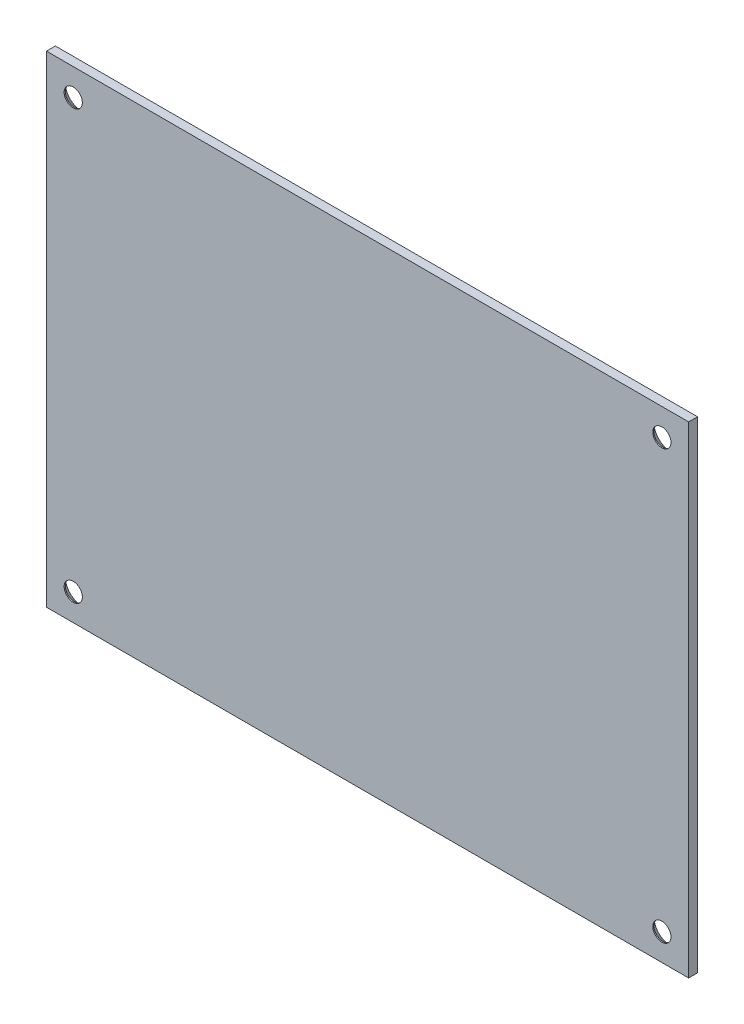
ISO-10303-21;
HEADER;
FILE_DESCRIPTION(('STEP AP214'),'2;1');
FILE_NAME('part.step','',(''),(''),'','','');
FILE_SCHEMA(('AUTOMOTIVE_DESIGN { 1 0 10303 214 1 1 1 1 }'));
ENDSEC;
DATA;
#1=APPLICATION_CONTEXT('core data for automotive mechanical design processes');
#2=APPLICATION_PROTOCOL_DEFINITION('international standard','automotive_design',2000,#1);
#3=PRODUCT_CONTEXT('',#1,'mechanical');
#4=PRODUCT('Part','Part','',(#3));
#5=PRODUCT_RELATED_PRODUCT_CATEGORY('part','',(#4));
#6=PRODUCT_DEFINITION_FORMATION('','',#4);
#7=PRODUCT_DEFINITION_CONTEXT('part definition',#1,'design');
#8=PRODUCT_DEFINITION('design','',#6,#7);
#9=PRODUCT_DEFINITION_SHAPE('','',#8);
#10=(LENGTH_UNIT() NAMED_UNIT(*) SI_UNIT(.MILLI.,.METRE.));
#11=(NAMED_UNIT(*) PLANE_ANGLE_UNIT() SI_UNIT($,.RADIAN.));
#12=(NAMED_UNIT(*) SI_UNIT($,.STERADIAN.) SOLID_ANGLE_UNIT());
#13=UNCERTAINTY_MEASURE_WITH_UNIT(LENGTH_MEASURE(1.E-05),#10,'distance_accuracy_value','');
#14=(GEOMETRIC_REPRESENTATION_CONTEXT(3) GLOBAL_UNCERTAINTY_ASSIGNED_CONTEXT((#13)) GLOBAL_UNIT_ASSIGNED_CONTEXT((#10,
#11,#12)) REPRESENTATION_CONTEXT('',''));
#15=CARTESIAN_POINT('',(0.,0.,0.));
#16=DIRECTION('',(0.,0.,1.));
#17=DIRECTION('',(1.,0.,0.));
#18=AXIS2_PLACEMENT_3D('',#15,#16,#17);
#19=CARTESIAN_POINT('',(0.,0.,1.66));
#20=DIRECTION('',(1.,0.,0.));
#21=DIRECTION('',(0.,0.,-1.));
#22=AXIS2_PLACEMENT_3D('',#19,#20,#21);
#23=PLANE('',#22);
#24=DIRECTION('',(0.,-1.,0.));
#25=VECTOR('',#24,1.);
#26=CARTESIAN_POINT('',(0.,0.,0.));
#27=LINE('',#26,#25);
#28=CARTESIAN_POINT('',(0.,90.,0.));
#29=VERTEX_POINT('',#28);
#30=CARTESIAN_POINT('',(0.,0.,0.));
#31=VERTEX_POINT('',#30);
#32=EDGE_CURVE('E116',#29,#31,#27,.T.);
#33=ORIENTED_EDGE('',*,*,#32,.T.);
#34=DIRECTION('',(0.,0.,-1.));
#35=VECTOR('',#34,1.);
#36=CARTESIAN_POINT('',(0.,0.,1.66));
#37=LINE('',#36,#35);
#38=CARTESIAN_POINT('',(0.,0.,1.66));
#39=VERTEX_POINT('',#38);
#40=EDGE_CURVE('E11',#39,#31,#37,.T.);
#41=ORIENTED_EDGE('',*,*,#40,.F.);
#42=DIRECTION('',(0.,-1.,0.));
#43=VECTOR('',#42,1.);
#44=CARTESIAN_POINT('',(0.,0.,1.66));
#45=LINE('',#44,#43);
#46=CARTESIAN_POINT('',(0.,90.,1.66));
#47=VERTEX_POINT('',#46);
#48=EDGE_CURVE('E99',#47,#39,#45,.T.);
#49=ORIENTED_EDGE('',*,*,#48,.F.);
#50=DIRECTION('',(0.,0.,-1.));
#51=VECTOR('',#50,1.);
#52=CARTESIAN_POINT('',(0.,90.,1.66));
#53=LINE('',#52,#51);
#54=EDGE_CURVE('E112',#47,#29,#53,.T.);
#55=ORIENTED_EDGE('',*,*,#54,.T.);
#56=EDGE_LOOP('',(#33,#41,#49,#55));
#57=FACE_BOUND('',#56,.T.);
#58=ADVANCED_FACE('F45',(#57),#23,.F.);
#59=CARTESIAN_POINT('',(0.,0.,1.66));
#60=DIRECTION('',(0.,1.,0.));
#61=DIRECTION('',(0.,0.,1.));
#62=AXIS2_PLACEMENT_3D('',#59,#60,#61);
#63=PLANE('',#62);
#64=DIRECTION('',(1.,0.,0.));
#65=VECTOR('',#64,1.);
#66=CARTESIAN_POINT('',(0.,0.,0.));
#67=LINE('',#66,#65);
#68=CARTESIAN_POINT('',(120.,0.,0.));
#69=VERTEX_POINT('',#68);
#70=EDGE_CURVE('E104',#31,#69,#67,.T.);
#71=ORIENTED_EDGE('',*,*,#70,.T.);
#72=DIRECTION('',(0.,0.,-1.));
#73=VECTOR('',#72,1.);
#74=CARTESIAN_POINT('',(120.,0.,1.66));
#75=LINE('',#74,#73);
#76=CARTESIAN_POINT('',(120.,0.,1.66));
#77=VERTEX_POINT('',#76);
#78=EDGE_CURVE('E55',#77,#69,#75,.T.);
#79=ORIENTED_EDGE('',*,*,#78,.F.);
#80=DIRECTION('',(1.,0.,0.));
#81=VECTOR('',#80,1.);
#82=CARTESIAN_POINT('',(0.,0.,1.66));
#83=LINE('',#82,#81);
#84=EDGE_CURVE('E94',#39,#77,#83,.T.);
#85=ORIENTED_EDGE('',*,*,#84,.F.);
#86=ORIENTED_EDGE('',*,*,#40,.T.);
#87=EDGE_LOOP('',(#71,#79,#85,#86));
#88=FACE_BOUND('',#87,.T.);
#89=ADVANCED_FACE('F103',(#88),#63,.F.);
#90=CARTESIAN_POINT('',(120.,0.,1.66));
#91=DIRECTION('',(-1.,0.,0.));
#92=DIRECTION('',(0.,0.,1.));
#93=AXIS2_PLACEMENT_3D('',#90,#91,#92);
#94=PLANE('',#93);
#95=DIRECTION('',(0.,1.,0.));
#96=VECTOR('',#95,1.);
#97=CARTESIAN_POINT('',(120.,0.,0.));
#98=LINE('',#97,#96);
#99=CARTESIAN_POINT('',(120.,90.,0.));
#100=VERTEX_POINT('',#99);
#101=EDGE_CURVE('E81',#69,#100,#98,.T.);
#102=ORIENTED_EDGE('',*,*,#101,.T.);
#103=DIRECTION('',(0.,0.,-1.));
#104=VECTOR('',#103,1.);
#105=CARTESIAN_POINT('',(120.,90.,1.66));
#106=LINE('',#105,#104);
#107=CARTESIAN_POINT('',(120.,90.,1.66));
#108=VERTEX_POINT('',#107);
#109=EDGE_CURVE('E106',#108,#100,#106,.T.);
#110=ORIENTED_EDGE('',*,*,#109,.F.);
#111=DIRECTION('',(0.,1.,0.));
#112=VECTOR('',#111,1.);
#113=CARTESIAN_POINT('',(120.,0.,1.66));
#114=LINE('',#113,#112);
#115=EDGE_CURVE('E97',#77,#108,#114,.T.);
#116=ORIENTED_EDGE('',*,*,#115,.F.);
#117=ORIENTED_EDGE('',*,*,#78,.T.);
#118=EDGE_LOOP('',(#102,#110,#116,#117));
#119=FACE_BOUND('',#118,.T.);
#120=ADVANCED_FACE('F108',(#119),#94,.F.);
#121=CARTESIAN_POINT('',(0.,90.,1.66));
#122=DIRECTION('',(0.,-1.,0.));
#123=DIRECTION('',(0.,0.,-1.));
#124=AXIS2_PLACEMENT_3D('',#121,#122,#123);
#125=PLANE('',#124);
#126=DIRECTION('',(-1.,0.,0.));
#127=VECTOR('',#126,1.);
#128=CARTESIAN_POINT('',(0.,90.,0.));
#129=LINE('',#128,#127);
#130=EDGE_CURVE('E87',#100,#29,#129,.T.);
#131=ORIENTED_EDGE('',*,*,#130,.T.);
#132=ORIENTED_EDGE('',*,*,#54,.F.);
#133=DIRECTION('',(-1.,0.,0.));
#134=VECTOR('',#133,1.);
#135=CARTESIAN_POINT('',(0.,90.,1.66));
#136=LINE('',#135,#134);
#137=EDGE_CURVE('E64',#108,#47,#136,.T.);
#138=ORIENTED_EDGE('',*,*,#137,.F.);
#139=ORIENTED_EDGE('',*,*,#109,.T.);
#140=EDGE_LOOP('',(#131,#132,#138,#139));
#141=FACE_BOUND('',#140,.T.);
#142=ADVANCED_FACE('F189',(#141),#125,.F.);
#143=CARTESIAN_POINT('',(0.,0.,1.66));
#144=DIRECTION('',(0.,0.,-1.));
#145=DIRECTION('',(-1.,0.,0.));
#146=AXIS2_PLACEMENT_3D('',#143,#144,#145);
#147=PLANE('',#146);
#148=CARTESIAN_POINT('',(5.,5.,1.66));
#149=DIRECTION('',(0.,0.,-1.));
#150=DIRECTION('',(-1.,0.,0.));
#151=AXIS2_PLACEMENT_3D('',#148,#149,#150);
#152=CIRCLE('',#151,1.69999999999999);
#153=CARTESIAN_POINT('',(3.30000000000001,5.,1.66));
#154=VERTEX_POINT('',#153);
#155=EDGE_CURVE('E48',#154,#154,#152,.T.);
#156=ORIENTED_EDGE('',*,*,#155,.T.);
#157=EDGE_LOOP('',(#156));
#158=FACE_BOUND('',#157,.T.);
#159=CARTESIAN_POINT('',(5.,85.,1.66));
#160=DIRECTION('',(0.,0.,-1.));
#161=DIRECTION('',(-1.,0.,0.));
#162=AXIS2_PLACEMENT_3D('',#159,#160,#161);
#163=CIRCLE('',#162,1.69999999999999);
#164=CARTESIAN_POINT('',(3.30000000000001,85.,1.66));
#165=VERTEX_POINT('',#164);
#166=EDGE_CURVE('E140',#165,#165,#163,.T.);
#167=ORIENTED_EDGE('',*,*,#166,.T.);
#168=EDGE_LOOP('',(#167));
#169=FACE_BOUND('',#168,.T.);
#170=CARTESIAN_POINT('',(115.,85.,1.66));
#171=DIRECTION('',(0.,0.,-1.));
#172=DIRECTION('',(-1.,0.,0.));
#173=AXIS2_PLACEMENT_3D('',#170,#171,#172);
#174=CIRCLE('',#173,1.69999999999999);
#175=CARTESIAN_POINT('',(113.3,85.,1.66));
#176=VERTEX_POINT('',#175);
#177=EDGE_CURVE('E135',#176,#176,#174,.T.);
#178=ORIENTED_EDGE('',*,*,#177,.T.);
#179=EDGE_LOOP('',(#178));
#180=FACE_BOUND('',#179,.T.);
#181=CARTESIAN_POINT('',(115.,5.,1.66));
#182=DIRECTION('',(0.,0.,-1.));
#183=DIRECTION('',(-1.,0.,0.));
#184=AXIS2_PLACEMENT_3D('',#181,#182,#183);
#185=CIRCLE('',#184,1.69999999999999);
#186=CARTESIAN_POINT('',(113.3,5.,1.66));
#187=VERTEX_POINT('',#186);
#188=EDGE_CURVE('E120',#187,#187,#185,.T.);
#189=ORIENTED_EDGE('',*,*,#188,.T.);
#190=EDGE_LOOP('',(#189));
#191=FACE_BOUND('',#190,.T.);
#192=ORIENTED_EDGE('',*,*,#48,.T.);
#193=ORIENTED_EDGE('',*,*,#84,.T.);
#194=ORIENTED_EDGE('',*,*,#115,.T.);
#195=ORIENTED_EDGE('',*,*,#137,.T.);
#196=EDGE_LOOP('',(#192,#193,#194,#195));
#197=FACE_BOUND('',#196,.T.);
#198=ADVANCED_FACE('F95',(#158,#169,#180,#191,#197),#147,.F.);
#199=CARTESIAN_POINT('',(0.,0.,0.));
#200=DIRECTION('',(0.,0.,-1.));
#201=DIRECTION('',(-1.,0.,0.));
#202=AXIS2_PLACEMENT_3D('',#199,#200,#201);
#203=PLANE('',#202);
#204=CARTESIAN_POINT('',(5.,5.,0.));
#205=DIRECTION('',(0.,0.,-1.));
#206=DIRECTION('',(-1.,0.,0.));
#207=AXIS2_PLACEMENT_3D('',#204,#205,#206);
#208=CIRCLE('',#207,3.15);
#209=CARTESIAN_POINT('',(1.85,5.,0.));
#210=VERTEX_POINT('',#209);
#211=EDGE_CURVE('E308',#210,#210,#208,.T.);
#212=ORIENTED_EDGE('',*,*,#211,.F.);
#213=EDGE_LOOP('',(#212));
#214=FACE_BOUND('',#213,.T.);
#215=CARTESIAN_POINT('',(5.,85.,0.));
#216=DIRECTION('',(0.,0.,-1.));
#217=DIRECTION('',(-1.,0.,0.));
#218=AXIS2_PLACEMENT_3D('',#215,#216,#217);
#219=CIRCLE('',#218,3.15);
#220=CARTESIAN_POINT('',(1.85,85.,0.));
#221=VERTEX_POINT('',#220);
#222=EDGE_CURVE('E152',#221,#221,#219,.T.);
#223=ORIENTED_EDGE('',*,*,#222,.F.);
#224=EDGE_LOOP('',(#223));
#225=FACE_BOUND('',#224,.T.);
#226=CARTESIAN_POINT('',(115.,85.,0.));
#227=DIRECTION('',(0.,0.,-1.));
#228=DIRECTION('',(-1.,0.,0.));
#229=AXIS2_PLACEMENT_3D('',#226,#227,#228);
#230=CIRCLE('',#229,3.15);
#231=CARTESIAN_POINT('',(111.85,85.,0.));
#232=VERTEX_POINT('',#231);
#233=EDGE_CURVE('E143',#232,#232,#230,.T.);
#234=ORIENTED_EDGE('',*,*,#233,.F.);
#235=EDGE_LOOP('',(#234));
#236=FACE_BOUND('',#235,.T.);
#237=CARTESIAN_POINT('',(115.,5.,0.));
#238=DIRECTION('',(0.,0.,-1.));
#239=DIRECTION('',(-1.,0.,0.));
#240=AXIS2_PLACEMENT_3D('',#237,#238,#239);
#241=CIRCLE('',#240,3.15);
#242=CARTESIAN_POINT('',(111.85,5.,0.));
#243=VERTEX_POINT('',#242);
#244=EDGE_CURVE('E138',#243,#243,#241,.T.);
#245=ORIENTED_EDGE('',*,*,#244,.F.);
#246=EDGE_LOOP('',(#245));
#247=FACE_BOUND('',#246,.T.);
#248=ORIENTED_EDGE('',*,*,#32,.F.);
#249=ORIENTED_EDGE('',*,*,#130,.F.);
#250=ORIENTED_EDGE('',*,*,#101,.F.);
#251=ORIENTED_EDGE('',*,*,#70,.F.);
#252=EDGE_LOOP('',(#248,#249,#250,#251));
#253=FACE_BOUND('',#252,.T.);
#254=ADVANCED_FACE('F182',(#214,#225,#236,#247,#253),#203,.T.);
#255=CARTESIAN_POINT('',(115.,5.,0.));
#256=DIRECTION('',(0.,0.,-1.));
#257=DIRECTION('',(-1.,0.,0.));
#258=AXIS2_PLACEMENT_3D('',#255,#256,#257);
#259=CYLINDRICAL_SURFACE('',#258,1.69999999999999);
#260=CARTESIAN_POINT('',(115.,5.,1.45000000000001));
#261=DIRECTION('',(0.,0.,-1.));
#262=DIRECTION('',(-1.,0.,0.));
#263=AXIS2_PLACEMENT_3D('',#260,#261,#262);
#264=CIRCLE('',#263,1.69999999999999);
#265=CARTESIAN_POINT('',(113.3,5.,1.45000000000001));
#266=VERTEX_POINT('',#265);
#267=EDGE_CURVE('E134',#266,#266,#264,.T.);
#268=ORIENTED_EDGE('',*,*,#267,.T.);
#269=EDGE_LOOP('',(#268));
#270=FACE_BOUND('',#269,.T.);
#271=ORIENTED_EDGE('',*,*,#188,.F.);
#272=EDGE_LOOP('',(#271));
#273=FACE_BOUND('',#272,.T.);
#274=ADVANCED_FACE('F172',(#270,#273),#259,.F.);
#275=CARTESIAN_POINT('',(115.,5.,0.));
#276=DIRECTION('',(0.,0.,-1.));
#277=DIRECTION('',(-1.,0.,0.));
#278=AXIS2_PLACEMENT_3D('',#275,#276,#277);
#279=CONICAL_SURFACE('',#278,3.15,0.785398163397448);
#280=ORIENTED_EDGE('',*,*,#267,.F.);
#281=EDGE_LOOP('',(#280));
#282=FACE_BOUND('',#281,.T.);
#283=ORIENTED_EDGE('',*,*,#244,.T.);
#284=EDGE_LOOP('',(#283));
#285=FACE_BOUND('',#284,.T.);
#286=ADVANCED_FACE('F175',(#282,#285),#279,.F.);
#287=CARTESIAN_POINT('',(115.,85.,0.));
#288=DIRECTION('',(0.,0.,-1.));
#289=DIRECTION('',(-1.,0.,0.));
#290=AXIS2_PLACEMENT_3D('',#287,#288,#289);
#291=CYLINDRICAL_SURFACE('',#290,1.69999999999999);
#292=CARTESIAN_POINT('',(115.,85.,1.45000000000001));
#293=DIRECTION('',(0.,0.,-1.));
#294=DIRECTION('',(-1.,0.,0.));
#295=AXIS2_PLACEMENT_3D('',#292,#293,#294);
#296=CIRCLE('',#295,1.69999999999999);
#297=CARTESIAN_POINT('',(113.3,85.,1.45000000000001));
#298=VERTEX_POINT('',#297);
#299=EDGE_CURVE('E139',#298,#298,#296,.T.);
#300=ORIENTED_EDGE('',*,*,#299,.T.);
#301=EDGE_LOOP('',(#300));
#302=FACE_BOUND('',#301,.T.);
#303=ORIENTED_EDGE('',*,*,#177,.F.);
#304=EDGE_LOOP('',(#303));
#305=FACE_BOUND('',#304,.T.);
#306=ADVANCED_FACE('F178',(#302,#305),#291,.F.);
#307=CARTESIAN_POINT('',(115.,85.,0.));
#308=DIRECTION('',(0.,0.,-1.));
#309=DIRECTION('',(-1.,0.,0.));
#310=AXIS2_PLACEMENT_3D('',#307,#308,#309);
#311=CONICAL_SURFACE('',#310,3.15,0.785398163397448);
#312=ORIENTED_EDGE('',*,*,#299,.F.);
#313=EDGE_LOOP('',(#312));
#314=FACE_BOUND('',#313,.T.);
#315=ORIENTED_EDGE('',*,*,#233,.T.);
#316=EDGE_LOOP('',(#315));
#317=FACE_BOUND('',#316,.T.);
#318=ADVANCED_FACE('F250',(#314,#317),#311,.F.);
#319=CARTESIAN_POINT('',(5.,85.,0.));
#320=DIRECTION('',(0.,0.,-1.));
#321=DIRECTION('',(-1.,0.,0.));
#322=AXIS2_PLACEMENT_3D('',#319,#320,#321);
#323=CYLINDRICAL_SURFACE('',#322,1.69999999999999);
#324=CARTESIAN_POINT('',(5.,85.,1.45000000000001));
#325=DIRECTION('',(0.,0.,-1.));
#326=DIRECTION('',(-1.,0.,0.));
#327=AXIS2_PLACEMENT_3D('',#324,#325,#326);
#328=CIRCLE('',#327,1.69999999999999);
#329=CARTESIAN_POINT('',(3.30000000000001,85.,1.45000000000001));
#330=VERTEX_POINT('',#329);
#331=EDGE_CURVE('E144',#330,#330,#328,.T.);
#332=ORIENTED_EDGE('',*,*,#331,.T.);
#333=EDGE_LOOP('',(#332));
#334=FACE_BOUND('',#333,.T.);
#335=ORIENTED_EDGE('',*,*,#166,.F.);
#336=EDGE_LOOP('',(#335));
#337=FACE_BOUND('',#336,.T.);
#338=ADVANCED_FACE('F260',(#334,#337),#323,.F.);
#339=CARTESIAN_POINT('',(5.,85.,0.));
#340=DIRECTION('',(0.,0.,-1.));
#341=DIRECTION('',(-1.,0.,0.));
#342=AXIS2_PLACEMENT_3D('',#339,#340,#341);
#343=CONICAL_SURFACE('',#342,3.15,0.78539816339745);
#344=ORIENTED_EDGE('',*,*,#331,.F.);
#345=EDGE_LOOP('',(#344));
#346=FACE_BOUND('',#345,.T.);
#347=ORIENTED_EDGE('',*,*,#222,.T.);
#348=EDGE_LOOP('',(#347));
#349=FACE_BOUND('',#348,.T.);
#350=ADVANCED_FACE('F270',(#346,#349),#343,.F.);
#351=CARTESIAN_POINT('',(5.,5.,0.));
#352=DIRECTION('',(0.,0.,-1.));
#353=DIRECTION('',(-1.,0.,0.));
#354=AXIS2_PLACEMENT_3D('',#351,#352,#353);
#355=CYLINDRICAL_SURFACE('',#354,1.69999999999999);
#356=CARTESIAN_POINT('',(5.,5.,1.45000000000001));
#357=DIRECTION('',(0.,0.,-1.));
#358=DIRECTION('',(-1.,0.,0.));
#359=AXIS2_PLACEMENT_3D('',#356,#357,#358);
#360=CIRCLE('',#359,1.69999999999999);
#361=CARTESIAN_POINT('',(3.30000000000001,5.,1.45000000000001));
#362=VERTEX_POINT('',#361);
#363=EDGE_CURVE('E305',#362,#362,#360,.T.);
#364=ORIENTED_EDGE('',*,*,#363,.T.);
#365=EDGE_LOOP('',(#364));
#366=FACE_BOUND('',#365,.T.);
#367=ORIENTED_EDGE('',*,*,#155,.F.);
#368=EDGE_LOOP('',(#367));
#369=FACE_BOUND('',#368,.T.);
#370=ADVANCED_FACE('F279',(#366,#369),#355,.F.);
#371=CARTESIAN_POINT('',(5.,5.,0.));
#372=DIRECTION('',(0.,0.,-1.));
#373=DIRECTION('',(-1.,0.,0.));
#374=AXIS2_PLACEMENT_3D('',#371,#372,#373);
#375=CONICAL_SURFACE('',#374,3.15,0.78539816339745);
#376=ORIENTED_EDGE('',*,*,#363,.F.);
#377=EDGE_LOOP('',(#376));
#378=FACE_BOUND('',#377,.T.);
#379=ORIENTED_EDGE('',*,*,#211,.T.);
#380=EDGE_LOOP('',(#379));
#381=FACE_BOUND('',#380,.T.);
#382=ADVANCED_FACE('F289',(#378,#381),#375,.F.);
#383=CLOSED_SHELL('',(#58,#89,#120,#142,#198,#254,#274,#286,#306,#318,#338,#350,#370,#382));
#384=MANIFOLD_SOLID_BREP('B2',#383);
#385=ADVANCED_BREP_SHAPE_REPRESENTATION('',(#18,#384),#14);
#386=SHAPE_DEFINITION_REPRESENTATION(#9,#385);
ENDSEC;
END-ISO-10303-21;
